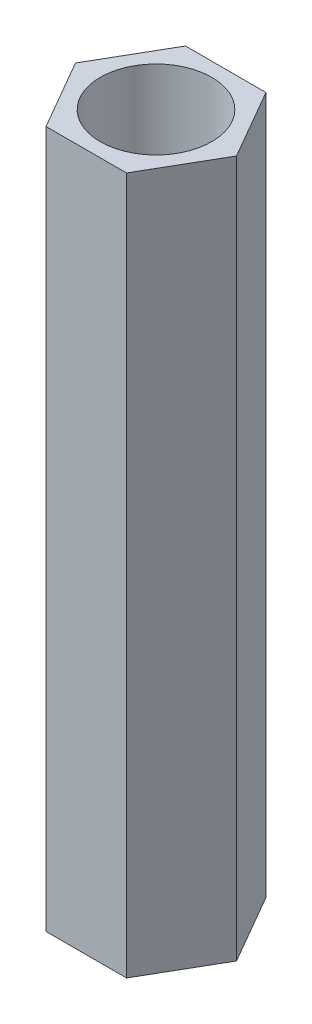
ISO-10303-21;
HEADER;
FILE_DESCRIPTION(('STEP AP214'),'2;1');
FILE_NAME('part.step','',(''),(''),'','','');
FILE_SCHEMA(('AUTOMOTIVE_DESIGN { 1 0 10303 214 1 1 1 1 }'));
ENDSEC;
DATA;
#1=APPLICATION_CONTEXT('core data for automotive mechanical design processes');
#2=APPLICATION_PROTOCOL_DEFINITION('international standard','automotive_design',2000,#1);
#3=PRODUCT_CONTEXT('',#1,'mechanical');
#4=PRODUCT('Part','Part','',(#3));
#5=PRODUCT_RELATED_PRODUCT_CATEGORY('part','',(#4));
#6=PRODUCT_DEFINITION_FORMATION('','',#4);
#7=PRODUCT_DEFINITION_CONTEXT('part definition',#1,'design');
#8=PRODUCT_DEFINITION('design','',#6,#7);
#9=PRODUCT_DEFINITION_SHAPE('','',#8);
#10=(LENGTH_UNIT() NAMED_UNIT(*) SI_UNIT(.MILLI.,.METRE.));
#11=(NAMED_UNIT(*) PLANE_ANGLE_UNIT() SI_UNIT($,.RADIAN.));
#12=(NAMED_UNIT(*) SI_UNIT($,.STERADIAN.) SOLID_ANGLE_UNIT());
#13=UNCERTAINTY_MEASURE_WITH_UNIT(LENGTH_MEASURE(1.E-05),#10,'distance_accuracy_value','');
#14=(GEOMETRIC_REPRESENTATION_CONTEXT(3) GLOBAL_UNCERTAINTY_ASSIGNED_CONTEXT((#13)) GLOBAL_UNIT_ASSIGNED_CONTEXT((#10,
#11,#12)) REPRESENTATION_CONTEXT('',''));
#15=CARTESIAN_POINT('',(0.,0.,0.));
#16=DIRECTION('',(0.,0.,1.));
#17=DIRECTION('',(1.,0.,0.));
#18=AXIS2_PLACEMENT_3D('',#15,#16,#17);
#19=CARTESIAN_POINT('',(0.,20.,0.));
#20=DIRECTION('',(0.,1.,0.));
#21=DIRECTION('',(0.,0.,1.));
#22=AXIS2_PLACEMENT_3D('',#19,#20,#21);
#23=PLANE('',#22);
#24=DIRECTION('',(0.5,0.,-0.866025403784439));
#25=VECTOR('',#24,1.);
#26=CARTESIAN_POINT('',(1.15470053837925,20.,2.));
#27=LINE('',#26,#25);
#28=CARTESIAN_POINT('',(1.15470053837925,20.,2.));
#29=VERTEX_POINT('',#28);
#30=CARTESIAN_POINT('',(2.3094010767585,20.,0.));
#31=VERTEX_POINT('',#30);
#32=EDGE_CURVE('E133',#29,#31,#27,.T.);
#33=ORIENTED_EDGE('',*,*,#32,.T.);
#34=DIRECTION('',(-0.5,0.,-0.866025403784439));
#35=VECTOR('',#34,1.);
#36=CARTESIAN_POINT('',(2.3094010767585,20.,0.));
#37=LINE('',#36,#35);
#38=CARTESIAN_POINT('',(1.15470053837925,20.,-2.));
#39=VERTEX_POINT('',#38);
#40=EDGE_CURVE('E91',#31,#39,#37,.T.);
#41=ORIENTED_EDGE('',*,*,#40,.T.);
#42=DIRECTION('',(-1.,0.,0.));
#43=VECTOR('',#42,1.);
#44=CARTESIAN_POINT('',(1.15470053837925,20.,-2.));
#45=LINE('',#44,#43);
#46=CARTESIAN_POINT('',(-1.15470053837925,20.,-2.));
#47=VERTEX_POINT('',#46);
#48=EDGE_CURVE('E104',#39,#47,#45,.T.);
#49=ORIENTED_EDGE('',*,*,#48,.T.);
#50=DIRECTION('',(-0.5,0.,0.866025403784439));
#51=VECTOR('',#50,1.);
#52=CARTESIAN_POINT('',(-1.15470053837925,20.,-2.));
#53=LINE('',#52,#51);
#54=CARTESIAN_POINT('',(-2.30940107675851,20.,0.));
#55=VERTEX_POINT('',#54);
#56=EDGE_CURVE('E98',#47,#55,#53,.T.);
#57=ORIENTED_EDGE('',*,*,#56,.T.);
#58=DIRECTION('',(0.5,0.,0.866025403784439));
#59=VECTOR('',#58,1.);
#60=CARTESIAN_POINT('',(-2.30940107675851,20.,0.));
#61=LINE('',#60,#59);
#62=CARTESIAN_POINT('',(-1.15470053837925,20.,2.));
#63=VERTEX_POINT('',#62);
#64=EDGE_CURVE('E102',#55,#63,#61,.T.);
#65=ORIENTED_EDGE('',*,*,#64,.T.);
#66=DIRECTION('',(1.,0.,0.));
#67=VECTOR('',#66,1.);
#68=CARTESIAN_POINT('',(-1.15470053837925,20.,2.));
#69=LINE('',#68,#67);
#70=EDGE_CURVE('E54',#63,#29,#69,.T.);
#71=ORIENTED_EDGE('',*,*,#70,.T.);
#72=EDGE_LOOP('',(#33,#41,#49,#57,#65,#71));
#73=FACE_BOUND('',#72,.T.);
#74=CARTESIAN_POINT('',(0.,20.,0.));
#75=DIRECTION('',(0.,1.,0.));
#76=DIRECTION('',(0.,0.,1.));
#77=AXIS2_PLACEMENT_3D('',#74,#75,#76);
#78=CIRCLE('',#77,1.6);
#79=CARTESIAN_POINT('',(0.,20.,1.6));
#80=VERTEX_POINT('',#79);
#81=EDGE_CURVE('E126',#80,#80,#78,.T.);
#82=ORIENTED_EDGE('',*,*,#81,.F.);
#83=EDGE_LOOP('',(#82));
#84=FACE_BOUND('',#83,.T.);
#85=ADVANCED_FACE('F37',(#73,#84),#23,.T.);
#86=CARTESIAN_POINT('',(0.,0.,0.));
#87=DIRECTION('',(0.,1.,0.));
#88=DIRECTION('',(0.,0.,1.));
#89=AXIS2_PLACEMENT_3D('',#86,#87,#88);
#90=PLANE('',#89);
#91=DIRECTION('',(0.5,0.,-0.866025403784439));
#92=VECTOR('',#91,1.);
#93=CARTESIAN_POINT('',(1.15470053837925,0.,2.));
#94=LINE('',#93,#92);
#95=CARTESIAN_POINT('',(1.15470053837925,0.,2.));
#96=VERTEX_POINT('',#95);
#97=CARTESIAN_POINT('',(2.3094010767585,0.,0.));
#98=VERTEX_POINT('',#97);
#99=EDGE_CURVE('E122',#96,#98,#94,.T.);
#100=ORIENTED_EDGE('',*,*,#99,.F.);
#101=DIRECTION('',(1.,0.,0.));
#102=VECTOR('',#101,1.);
#103=CARTESIAN_POINT('',(-1.15470053837925,0.,2.));
#104=LINE('',#103,#102);
#105=CARTESIAN_POINT('',(-1.15470053837925,0.,2.));
#106=VERTEX_POINT('',#105);
#107=EDGE_CURVE('E83',#106,#96,#104,.T.);
#108=ORIENTED_EDGE('',*,*,#107,.F.);
#109=DIRECTION('',(0.5,0.,0.866025403784439));
#110=VECTOR('',#109,1.);
#111=CARTESIAN_POINT('',(-2.30940107675851,0.,0.));
#112=LINE('',#111,#110);
#113=CARTESIAN_POINT('',(-2.30940107675851,0.,0.));
#114=VERTEX_POINT('',#113);
#115=EDGE_CURVE('E77',#114,#106,#112,.T.);
#116=ORIENTED_EDGE('',*,*,#115,.F.);
#117=DIRECTION('',(-0.5,0.,0.866025403784439));
#118=VECTOR('',#117,1.);
#119=CARTESIAN_POINT('',(-1.15470053837925,0.,-2.));
#120=LINE('',#119,#118);
#121=CARTESIAN_POINT('',(-1.15470053837925,0.,-2.));
#122=VERTEX_POINT('',#121);
#123=EDGE_CURVE('E112',#122,#114,#120,.T.);
#124=ORIENTED_EDGE('',*,*,#123,.F.);
#125=DIRECTION('',(-1.,0.,0.));
#126=VECTOR('',#125,1.);
#127=CARTESIAN_POINT('',(1.15470053837925,0.,-2.));
#128=LINE('',#127,#126);
#129=CARTESIAN_POINT('',(1.15470053837925,0.,-2.));
#130=VERTEX_POINT('',#129);
#131=EDGE_CURVE('E128',#130,#122,#128,.T.);
#132=ORIENTED_EDGE('',*,*,#131,.F.);
#133=DIRECTION('',(-0.5,0.,-0.866025403784439));
#134=VECTOR('',#133,1.);
#135=CARTESIAN_POINT('',(2.3094010767585,0.,0.));
#136=LINE('',#135,#134);
#137=EDGE_CURVE('E125',#98,#130,#136,.T.);
#138=ORIENTED_EDGE('',*,*,#137,.F.);
#139=EDGE_LOOP('',(#100,#108,#116,#124,#132,#138));
#140=FACE_BOUND('',#139,.T.);
#141=CARTESIAN_POINT('',(0.,0.,0.));
#142=DIRECTION('',(0.,1.,0.));
#143=DIRECTION('',(0.,0.,1.));
#144=AXIS2_PLACEMENT_3D('',#141,#142,#143);
#145=CIRCLE('',#144,1.6);
#146=CARTESIAN_POINT('',(0.,0.,1.6));
#147=VERTEX_POINT('',#146);
#148=EDGE_CURVE('E244',#147,#147,#145,.T.);
#149=ORIENTED_EDGE('',*,*,#148,.T.);
#150=EDGE_LOOP('',(#149));
#151=FACE_BOUND('',#150,.T.);
#152=ADVANCED_FACE('F142',(#140,#151),#90,.F.);
#153=CARTESIAN_POINT('',(1.15470053837925,20.,2.));
#154=DIRECTION('',(-0.866025403784439,0.,-0.5));
#155=DIRECTION('',(-0.5,0.,0.866025403784439));
#156=AXIS2_PLACEMENT_3D('',#153,#154,#155);
#157=PLANE('',#156);
#158=ORIENTED_EDGE('',*,*,#99,.T.);
#159=DIRECTION('',(0.,-1.,0.));
#160=VECTOR('',#159,1.);
#161=CARTESIAN_POINT('',(2.3094010767585,20.,0.));
#162=LINE('',#161,#160);
#163=EDGE_CURVE('E11',#31,#98,#162,.T.);
#164=ORIENTED_EDGE('',*,*,#163,.F.);
#165=ORIENTED_EDGE('',*,*,#32,.F.);
#166=DIRECTION('',(0.,-1.,0.));
#167=VECTOR('',#166,1.);
#168=CARTESIAN_POINT('',(1.15470053837925,20.,2.));
#169=LINE('',#168,#167);
#170=EDGE_CURVE('E118',#29,#96,#169,.T.);
#171=ORIENTED_EDGE('',*,*,#170,.T.);
#172=EDGE_LOOP('',(#158,#164,#165,#171));
#173=FACE_BOUND('',#172,.T.);
#174=ADVANCED_FACE('F39',(#173),#157,.F.);
#175=CARTESIAN_POINT('',(2.3094010767585,20.,0.));
#176=DIRECTION('',(-0.866025403784439,0.,0.5));
#177=DIRECTION('',(0.5,0.,0.866025403784439));
#178=AXIS2_PLACEMENT_3D('',#175,#176,#177);
#179=PLANE('',#178);
#180=ORIENTED_EDGE('',*,*,#137,.T.);
#181=DIRECTION('',(0.,-1.,0.));
#182=VECTOR('',#181,1.);
#183=CARTESIAN_POINT('',(1.15470053837925,20.,-2.));
#184=LINE('',#183,#182);
#185=EDGE_CURVE('E46',#39,#130,#184,.T.);
#186=ORIENTED_EDGE('',*,*,#185,.F.);
#187=ORIENTED_EDGE('',*,*,#40,.F.);
#188=ORIENTED_EDGE('',*,*,#163,.T.);
#189=EDGE_LOOP('',(#180,#186,#187,#188));
#190=FACE_BOUND('',#189,.T.);
#191=ADVANCED_FACE('F167',(#190),#179,.F.);
#192=CARTESIAN_POINT('',(1.15470053837925,20.,-2.));
#193=DIRECTION('',(0.,0.,1.));
#194=DIRECTION('',(1.,0.,0.));
#195=AXIS2_PLACEMENT_3D('',#192,#193,#194);
#196=PLANE('',#195);
#197=ORIENTED_EDGE('',*,*,#131,.T.);
#198=DIRECTION('',(0.,-1.,0.));
#199=VECTOR('',#198,1.);
#200=CARTESIAN_POINT('',(-1.15470053837925,20.,-2.));
#201=LINE('',#200,#199);
#202=EDGE_CURVE('E113',#47,#122,#201,.T.);
#203=ORIENTED_EDGE('',*,*,#202,.F.);
#204=ORIENTED_EDGE('',*,*,#48,.F.);
#205=ORIENTED_EDGE('',*,*,#185,.T.);
#206=EDGE_LOOP('',(#197,#203,#204,#205));
#207=FACE_BOUND('',#206,.T.);
#208=ADVANCED_FACE('F139',(#207),#196,.F.);
#209=CARTESIAN_POINT('',(-1.15470053837925,20.,-2.));
#210=DIRECTION('',(0.866025403784439,0.,0.5));
#211=DIRECTION('',(0.5,0.,-0.866025403784439));
#212=AXIS2_PLACEMENT_3D('',#209,#210,#211);
#213=PLANE('',#212);
#214=ORIENTED_EDGE('',*,*,#123,.T.);
#215=DIRECTION('',(0.,-1.,0.));
#216=VECTOR('',#215,1.);
#217=CARTESIAN_POINT('',(-2.30940107675851,20.,0.));
#218=LINE('',#217,#216);
#219=EDGE_CURVE('E109',#55,#114,#218,.T.);
#220=ORIENTED_EDGE('',*,*,#219,.F.);
#221=ORIENTED_EDGE('',*,*,#56,.F.);
#222=ORIENTED_EDGE('',*,*,#202,.T.);
#223=EDGE_LOOP('',(#214,#220,#221,#222));
#224=FACE_BOUND('',#223,.T.);
#225=ADVANCED_FACE('F110',(#224),#213,.F.);
#226=CARTESIAN_POINT('',(-2.30940107675851,20.,0.));
#227=DIRECTION('',(0.866025403784438,0.,-0.5));
#228=DIRECTION('',(-0.5,0.,-0.866025403784439));
#229=AXIS2_PLACEMENT_3D('',#226,#227,#228);
#230=PLANE('',#229);
#231=ORIENTED_EDGE('',*,*,#115,.T.);
#232=DIRECTION('',(0.,-1.,0.));
#233=VECTOR('',#232,1.);
#234=CARTESIAN_POINT('',(-1.15470053837925,20.,2.));
#235=LINE('',#234,#233);
#236=EDGE_CURVE('E114',#63,#106,#235,.T.);
#237=ORIENTED_EDGE('',*,*,#236,.F.);
#238=ORIENTED_EDGE('',*,*,#64,.F.);
#239=ORIENTED_EDGE('',*,*,#219,.T.);
#240=EDGE_LOOP('',(#231,#237,#238,#239));
#241=FACE_BOUND('',#240,.T.);
#242=ADVANCED_FACE('F116',(#241),#230,.F.);
#243=CARTESIAN_POINT('',(-1.15470053837925,20.,2.));
#244=DIRECTION('',(0.,0.,-1.));
#245=DIRECTION('',(-1.,0.,0.));
#246=AXIS2_PLACEMENT_3D('',#243,#244,#245);
#247=PLANE('',#246);
#248=ORIENTED_EDGE('',*,*,#107,.T.);
#249=ORIENTED_EDGE('',*,*,#170,.F.);
#250=ORIENTED_EDGE('',*,*,#70,.F.);
#251=ORIENTED_EDGE('',*,*,#236,.T.);
#252=EDGE_LOOP('',(#248,#249,#250,#251));
#253=FACE_BOUND('',#252,.T.);
#254=ADVANCED_FACE('F147',(#253),#247,.F.);
#255=CARTESIAN_POINT('',(0.,20.,0.));
#256=DIRECTION('',(0.,-1.,0.));
#257=DIRECTION('',(0.,0.,-1.));
#258=AXIS2_PLACEMENT_3D('',#255,#256,#257);
#259=CYLINDRICAL_SURFACE('',#258,1.6);
#260=ORIENTED_EDGE('',*,*,#81,.T.);
#261=EDGE_LOOP('',(#260));
#262=FACE_BOUND('',#261,.T.);
#263=ORIENTED_EDGE('',*,*,#148,.F.);
#264=EDGE_LOOP('',(#263));
#265=FACE_BOUND('',#264,.T.);
#266=ADVANCED_FACE('F149',(#262,#265),#259,.F.);
#267=CLOSED_SHELL('',(#85,#152,#174,#191,#208,#225,#242,#254,#266));
#268=MANIFOLD_SOLID_BREP('B2',#267);
#269=ADVANCED_BREP_SHAPE_REPRESENTATION('',(#18,#268),#14);
#270=SHAPE_DEFINITION_REPRESENTATION(#9,#269);
ENDSEC;
END-ISO-10303-21;
